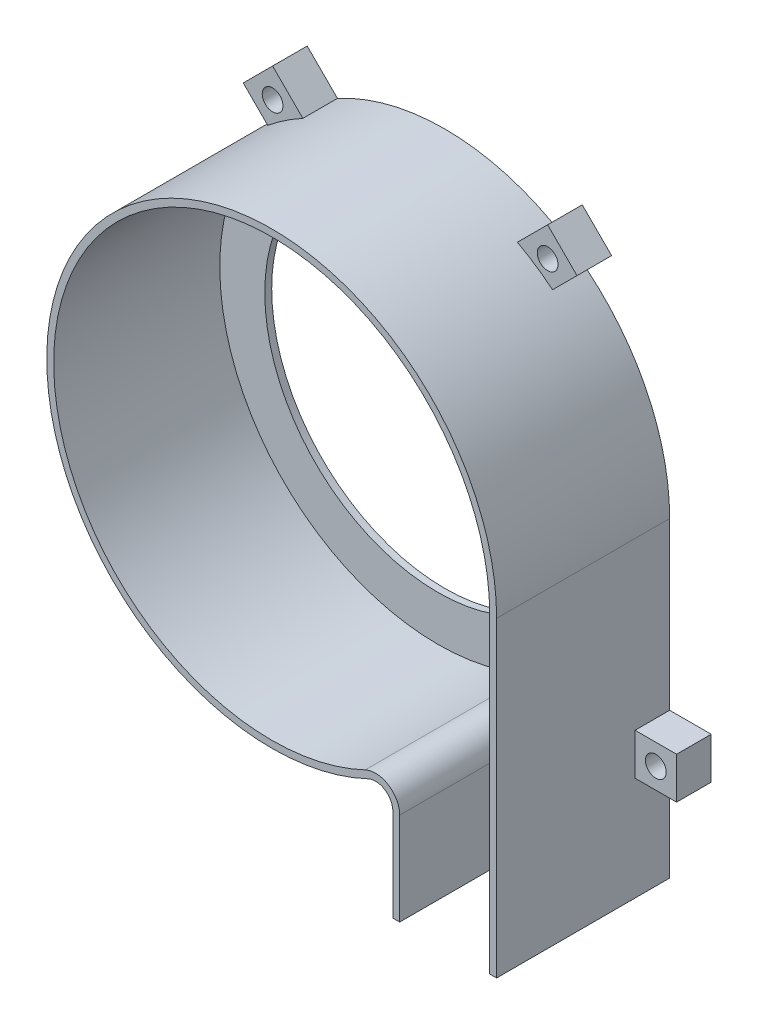
ISO-10303-21;
HEADER;
FILE_DESCRIPTION(('STEP AP214'),'2;1');
FILE_NAME('part.step','',(''),(''),'','','');
FILE_SCHEMA(('AUTOMOTIVE_DESIGN { 1 0 10303 214 1 1 1 1 }'));
ENDSEC;
DATA;
#1=APPLICATION_CONTEXT('core data for automotive mechanical design processes');
#2=APPLICATION_PROTOCOL_DEFINITION('international standard','automotive_design',2000,#1);
#3=PRODUCT_CONTEXT('',#1,'mechanical');
#4=PRODUCT('Part','Part','',(#3));
#5=PRODUCT_RELATED_PRODUCT_CATEGORY('part','',(#4));
#6=PRODUCT_DEFINITION_FORMATION('','',#4);
#7=PRODUCT_DEFINITION_CONTEXT('part definition',#1,'design');
#8=PRODUCT_DEFINITION('design','',#6,#7);
#9=PRODUCT_DEFINITION_SHAPE('','',#8);
#10=(LENGTH_UNIT() NAMED_UNIT(*) SI_UNIT(.MILLI.,.METRE.));
#11=(NAMED_UNIT(*) PLANE_ANGLE_UNIT() SI_UNIT($,.RADIAN.));
#12=(NAMED_UNIT(*) SI_UNIT($,.STERADIAN.) SOLID_ANGLE_UNIT());
#13=UNCERTAINTY_MEASURE_WITH_UNIT(LENGTH_MEASURE(1.E-05),#10,'distance_accuracy_value','');
#14=(GEOMETRIC_REPRESENTATION_CONTEXT(3) GLOBAL_UNCERTAINTY_ASSIGNED_CONTEXT((#13)) GLOBAL_UNIT_ASSIGNED_CONTEXT((#10,
#11,#12)) REPRESENTATION_CONTEXT('',''));
#15=CARTESIAN_POINT('',(0.,0.,0.));
#16=DIRECTION('',(0.,0.,1.));
#17=DIRECTION('',(1.,0.,0.));
#18=AXIS2_PLACEMENT_3D('',#15,#16,#17);
#19=CARTESIAN_POINT('',(0.,0.,30.));
#20=DIRECTION('',(0.,0.,-1.));
#21=DIRECTION('',(-1.,0.,0.));
#22=AXIS2_PLACEMENT_3D('',#19,#20,#21);
#23=CYLINDRICAL_SURFACE('',#22,32.5);
#24=CARTESIAN_POINT('',(0.,0.,0.));
#25=DIRECTION('',(0.,0.,1.));
#26=DIRECTION('',(1.,0.,0.));
#27=AXIS2_PLACEMENT_3D('',#24,#25,#26);
#28=CIRCLE('',#27,32.5);
#29=CARTESIAN_POINT('',(15.500260247219,28.5655725002753,0.));
#30=VERTEX_POINT('',#29);
#31=CARTESIAN_POINT('',(-15.500260247219,28.5655725002753,0.));
#32=VERTEX_POINT('',#31);
#33=EDGE_CURVE('E416',#30,#32,#28,.T.);
#34=ORIENTED_EDGE('',*,*,#33,.T.);
#35=DIRECTION('',(0.,0.,-1.));
#36=VECTOR('',#35,1.);
#37=CARTESIAN_POINT('',(-15.500260247219,28.5655725002753,5.));
#38=LINE('',#37,#36);
#39=CARTESIAN_POINT('',(-15.500260247219,28.5655725002753,5.));
#40=VERTEX_POINT('',#39);
#41=EDGE_CURVE('E56',#40,#32,#38,.T.);
#42=ORIENTED_EDGE('',*,*,#41,.F.);
#43=CARTESIAN_POINT('',(0.,0.,5.));
#44=DIRECTION('',(0.,0.,-1.));
#45=DIRECTION('',(-1.,0.,0.));
#46=AXIS2_PLACEMENT_3D('',#43,#44,#45);
#47=CIRCLE('',#46,32.5);
#48=CARTESIAN_POINT('',(-20.5765721784949,25.1566030573126,5.));
#49=VERTEX_POINT('',#48);
#50=EDGE_CURVE('E60',#49,#40,#47,.T.);
#51=ORIENTED_EDGE('',*,*,#50,.F.);
#52=DIRECTION('',(0.,0.,-1.));
#53=VECTOR('',#52,1.);
#54=CARTESIAN_POINT('',(-20.5765721784949,25.1566030573126,5.));
#55=LINE('',#54,#53);
#56=CARTESIAN_POINT('',(-20.5765721784949,25.1566030573126,0.));
#57=VERTEX_POINT('',#56);
#58=EDGE_CURVE('E202',#49,#57,#55,.T.);
#59=ORIENTED_EDGE('',*,*,#58,.T.);
#60=CARTESIAN_POINT('',(13.9285714285714,-29.3640068444207,0.));
#61=VERTEX_POINT('',#60);
#62=EDGE_CURVE('E411',#57,#61,#28,.T.);
#63=ORIENTED_EDGE('',*,*,#62,.T.);
#64=DIRECTION('',(0.,0.,-1.));
#65=VECTOR('',#64,1.);
#66=CARTESIAN_POINT('',(13.9285714285714,-29.3640068444207,30.));
#67=LINE('',#66,#65);
#68=CARTESIAN_POINT('',(13.9285714285714,-29.3640068444207,25.));
#69=VERTEX_POINT('',#68);
#70=EDGE_CURVE('E49',#69,#61,#67,.T.);
#71=ORIENTED_EDGE('',*,*,#70,.F.);
#72=CARTESIAN_POINT('',(0.,0.,25.));
#73=DIRECTION('',(0.,0.,1.));
#74=DIRECTION('',(1.,0.,0.));
#75=AXIS2_PLACEMENT_3D('',#72,#73,#74);
#76=CIRCLE('',#75,32.5);
#77=CARTESIAN_POINT('',(32.5,0.,25.));
#78=VERTEX_POINT('',#77);
#79=EDGE_CURVE('E329',#78,#69,#76,.T.);
#80=ORIENTED_EDGE('',*,*,#79,.F.);
#81=DIRECTION('',(0.,0.,-1.));
#82=VECTOR('',#81,1.);
#83=CARTESIAN_POINT('',(32.5,0.,30.));
#84=LINE('',#83,#82);
#85=CARTESIAN_POINT('',(32.5,0.,0.));
#86=VERTEX_POINT('',#85);
#87=EDGE_CURVE('E432',#78,#86,#84,.T.);
#88=ORIENTED_EDGE('',*,*,#87,.T.);
#89=CARTESIAN_POINT('',(20.5765721784949,25.1566030573126,0.));
#90=VERTEX_POINT('',#89);
#91=EDGE_CURVE('E412',#86,#90,#28,.T.);
#92=ORIENTED_EDGE('',*,*,#91,.T.);
#93=DIRECTION('',(0.,0.,-1.));
#94=VECTOR('',#93,1.);
#95=CARTESIAN_POINT('',(20.5765721784949,25.1566030573126,5.));
#96=LINE('',#95,#94);
#97=CARTESIAN_POINT('',(20.5765721784949,25.1566030573126,5.));
#98=VERTEX_POINT('',#97);
#99=EDGE_CURVE('E282',#98,#90,#96,.T.);
#100=ORIENTED_EDGE('',*,*,#99,.F.);
#101=CARTESIAN_POINT('',(0.,0.,5.));
#102=DIRECTION('',(0.,0.,-1.));
#103=DIRECTION('',(-1.,0.,0.));
#104=AXIS2_PLACEMENT_3D('',#101,#102,#103);
#105=CIRCLE('',#104,32.5);
#106=CARTESIAN_POINT('',(15.500260247219,28.5655725002753,5.));
#107=VERTEX_POINT('',#106);
#108=EDGE_CURVE('E260',#107,#98,#105,.T.);
#109=ORIENTED_EDGE('',*,*,#108,.F.);
#110=DIRECTION('',(0.,0.,-1.));
#111=VECTOR('',#110,1.);
#112=CARTESIAN_POINT('',(15.500260247219,28.5655725002753,5.));
#113=LINE('',#112,#111);
#114=EDGE_CURVE('E277',#107,#30,#113,.T.);
#115=ORIENTED_EDGE('',*,*,#114,.T.);
#116=EDGE_LOOP('',(#34,#42,#51,#59,#63,#71,#80,#88,#92,#100,#109,#115));
#117=FACE_BOUND('',#116,.T.);
#118=ADVANCED_FACE('F41',(#117),#23,.T.);
#119=CARTESIAN_POINT('',(32.5,0.,30.));
#120=DIRECTION('',(-1.,0.,0.));
#121=DIRECTION('',(0.,-1.,0.));
#122=AXIS2_PLACEMENT_3D('',#119,#120,#121);
#123=PLANE('',#122);
#124=DIRECTION('',(0.,0.,-1.));
#125=VECTOR('',#124,1.);
#126=CARTESIAN_POINT('',(32.5,-24.,5.));
#127=LINE('',#126,#125);
#128=CARTESIAN_POINT('',(32.5,-24.,5.));
#129=VERTEX_POINT('',#128);
#130=CARTESIAN_POINT('',(32.5,-24.,0.));
#131=VERTEX_POINT('',#130);
#132=EDGE_CURVE('E325',#129,#131,#127,.T.);
#133=ORIENTED_EDGE('',*,*,#132,.T.);
#134=DIRECTION('',(0.,1.,0.));
#135=VECTOR('',#134,1.);
#136=CARTESIAN_POINT('',(32.5,0.,0.));
#137=LINE('',#136,#135);
#138=EDGE_CURVE('E428',#131,#86,#137,.T.);
#139=ORIENTED_EDGE('',*,*,#138,.T.);
#140=ORIENTED_EDGE('',*,*,#87,.F.);
#141=DIRECTION('',(0.,1.,0.));
#142=VECTOR('',#141,1.);
#143=CARTESIAN_POINT('',(32.5,-45.,25.));
#144=LINE('',#143,#142);
#145=CARTESIAN_POINT('',(32.5,-45.,25.));
#146=VERTEX_POINT('',#145);
#147=EDGE_CURVE('E353',#146,#78,#144,.T.);
#148=ORIENTED_EDGE('',*,*,#147,.F.);
#149=DIRECTION('',(0.,0.,-1.));
#150=VECTOR('',#149,1.);
#151=CARTESIAN_POINT('',(32.5,-45.,30.));
#152=LINE('',#151,#150);
#153=CARTESIAN_POINT('',(32.5,-45.,0.));
#154=VERTEX_POINT('',#153);
#155=EDGE_CURVE('E436',#146,#154,#152,.T.);
#156=ORIENTED_EDGE('',*,*,#155,.T.);
#157=CARTESIAN_POINT('',(32.5,-30.,0.));
#158=VERTEX_POINT('',#157);
#159=EDGE_CURVE('E429',#154,#158,#137,.T.);
#160=ORIENTED_EDGE('',*,*,#159,.T.);
#161=DIRECTION('',(0.,0.,-1.));
#162=VECTOR('',#161,1.);
#163=CARTESIAN_POINT('',(32.5,-30.,5.));
#164=LINE('',#163,#162);
#165=CARTESIAN_POINT('',(32.5,-30.,5.));
#166=VERTEX_POINT('',#165);
#167=EDGE_CURVE('E330',#166,#158,#164,.T.);
#168=ORIENTED_EDGE('',*,*,#167,.F.);
#169=DIRECTION('',(0.,-1.,0.));
#170=VECTOR('',#169,1.);
#171=CARTESIAN_POINT('',(32.5,0.,5.));
#172=LINE('',#171,#170);
#173=EDGE_CURVE('E308',#129,#166,#172,.T.);
#174=ORIENTED_EDGE('',*,*,#173,.F.);
#175=EDGE_LOOP('',(#133,#139,#140,#148,#156,#160,#168,#174));
#176=FACE_BOUND('',#175,.T.);
#177=ADVANCED_FACE('F499',(#176),#123,.F.);
#178=CARTESIAN_POINT('',(17.5,-45.,30.));
#179=DIRECTION('',(0.,1.,0.));
#180=DIRECTION('',(-1.,0.,0.));
#181=AXIS2_PLACEMENT_3D('',#178,#179,#180);
#182=PLANE('',#181);
#183=DIRECTION('',(1.,0.,0.));
#184=VECTOR('',#183,1.);
#185=CARTESIAN_POINT('',(17.5,-45.,25.));
#186=LINE('',#185,#184);
#187=CARTESIAN_POINT('',(17.5,-45.,25.));
#188=VERTEX_POINT('',#187);
#189=CARTESIAN_POINT('',(18.5,-45.,25.));
#190=VERTEX_POINT('',#189);
#191=EDGE_CURVE('E350',#188,#190,#186,.T.);
#192=ORIENTED_EDGE('',*,*,#191,.F.);
#193=DIRECTION('',(0.,0.,-1.));
#194=VECTOR('',#193,1.);
#195=CARTESIAN_POINT('',(17.5,-45.,30.));
#196=LINE('',#195,#194);
#197=CARTESIAN_POINT('',(17.5,-45.,0.));
#198=VERTEX_POINT('',#197);
#199=EDGE_CURVE('E439',#188,#198,#196,.T.);
#200=ORIENTED_EDGE('',*,*,#199,.T.);
#201=DIRECTION('',(1.,0.,0.));
#202=VECTOR('',#201,1.);
#203=CARTESIAN_POINT('',(17.5,-45.,0.));
#204=LINE('',#203,#202);
#205=EDGE_CURVE('E424',#198,#154,#204,.T.);
#206=ORIENTED_EDGE('',*,*,#205,.T.);
#207=ORIENTED_EDGE('',*,*,#155,.F.);
#208=CARTESIAN_POINT('',(31.5,-45.,25.));
#209=VERTEX_POINT('',#208);
#210=EDGE_CURVE('E349',#209,#146,#186,.T.);
#211=ORIENTED_EDGE('',*,*,#210,.F.);
#212=DIRECTION('',(0.,0.,-1.));
#213=VECTOR('',#212,1.);
#214=CARTESIAN_POINT('',(31.5,-45.,30.));
#215=LINE('',#214,#213);
#216=CARTESIAN_POINT('',(31.5,-45.,1.));
#217=VERTEX_POINT('',#216);
#218=EDGE_CURVE('E382',#209,#217,#215,.T.);
#219=ORIENTED_EDGE('',*,*,#218,.T.);
#220=DIRECTION('',(1.,0.,0.));
#221=VECTOR('',#220,1.);
#222=CARTESIAN_POINT('',(17.5,-45.,1.));
#223=LINE('',#222,#221);
#224=CARTESIAN_POINT('',(18.5,-45.,1.));
#225=VERTEX_POINT('',#224);
#226=EDGE_CURVE('E387',#225,#217,#223,.T.);
#227=ORIENTED_EDGE('',*,*,#226,.F.);
#228=DIRECTION('',(0.,0.,-1.));
#229=VECTOR('',#228,1.);
#230=CARTESIAN_POINT('',(18.5,-45.,30.));
#231=LINE('',#230,#229);
#232=EDGE_CURVE('E397',#190,#225,#231,.T.);
#233=ORIENTED_EDGE('',*,*,#232,.F.);
#234=EDGE_LOOP('',(#192,#200,#206,#207,#211,#219,#227,#233));
#235=FACE_BOUND('',#234,.T.);
#236=ADVANCED_FACE('F469',(#235),#182,.F.);
#237=CARTESIAN_POINT('',(15.,-31.6227766016838,30.));
#238=DIRECTION('',(0.,0.,-1.));
#239=DIRECTION('',(-1.,0.,0.));
#240=AXIS2_PLACEMENT_3D('',#237,#238,#239);
#241=CYLINDRICAL_SURFACE('',#240,2.5);
#242=CARTESIAN_POINT('',(15.,-31.6227766016838,25.));
#243=DIRECTION('',(0.,0.,-1.));
#244=DIRECTION('',(1.,0.,0.));
#245=AXIS2_PLACEMENT_3D('',#242,#243,#244);
#246=CIRCLE('',#245,2.5);
#247=CARTESIAN_POINT('',(17.5,-31.6227766016838,25.));
#248=VERTEX_POINT('',#247);
#249=EDGE_CURVE('E343',#69,#248,#246,.T.);
#250=ORIENTED_EDGE('',*,*,#249,.F.);
#251=ORIENTED_EDGE('',*,*,#70,.T.);
#252=CARTESIAN_POINT('',(15.,-31.6227766016838,0.));
#253=DIRECTION('',(0.,0.,-1.));
#254=DIRECTION('',(1.,0.,0.));
#255=AXIS2_PLACEMENT_3D('',#252,#253,#254);
#256=CIRCLE('',#255,2.5);
#257=CARTESIAN_POINT('',(17.5,-31.6227766016838,0.));
#258=VERTEX_POINT('',#257);
#259=EDGE_CURVE('E415',#61,#258,#256,.T.);
#260=ORIENTED_EDGE('',*,*,#259,.T.);
#261=DIRECTION('',(0.,0.,-1.));
#262=VECTOR('',#261,1.);
#263=CARTESIAN_POINT('',(17.5,-31.6227766016838,30.));
#264=LINE('',#263,#262);
#265=EDGE_CURVE('E442',#248,#258,#264,.T.);
#266=ORIENTED_EDGE('',*,*,#265,.F.);
#267=EDGE_LOOP('',(#250,#251,#260,#266));
#268=FACE_BOUND('',#267,.T.);
#269=ADVANCED_FACE('F450',(#268),#241,.F.);
#270=CARTESIAN_POINT('',(17.5,-31.6227766016838,30.));
#271=DIRECTION('',(1.,0.,0.));
#272=DIRECTION('',(0.,1.,0.));
#273=AXIS2_PLACEMENT_3D('',#270,#271,#272);
#274=PLANE('',#273);
#275=DIRECTION('',(0.,-1.,0.));
#276=VECTOR('',#275,1.);
#277=CARTESIAN_POINT('',(17.5,-31.6227766016838,25.));
#278=LINE('',#277,#276);
#279=EDGE_CURVE('E346',#248,#188,#278,.T.);
#280=ORIENTED_EDGE('',*,*,#279,.F.);
#281=ORIENTED_EDGE('',*,*,#265,.T.);
#282=DIRECTION('',(0.,-1.,0.));
#283=VECTOR('',#282,1.);
#284=CARTESIAN_POINT('',(17.5,-31.6227766016838,0.));
#285=LINE('',#284,#283);
#286=EDGE_CURVE('E420',#258,#198,#285,.T.);
#287=ORIENTED_EDGE('',*,*,#286,.T.);
#288=ORIENTED_EDGE('',*,*,#199,.F.);
#289=EDGE_LOOP('',(#280,#281,#287,#288));
#290=FACE_BOUND('',#289,.T.);
#291=ADVANCED_FACE('F463',(#290),#274,.F.);
#292=CARTESIAN_POINT('',(0.,0.,30.));
#293=DIRECTION('',(0.,0.,-1.));
#294=DIRECTION('',(-1.,0.,0.));
#295=AXIS2_PLACEMENT_3D('',#292,#293,#294);
#296=CYLINDRICAL_SURFACE('',#295,31.5);
#297=DIRECTION('',(0.,0.,-1.));
#298=VECTOR('',#297,1.);
#299=CARTESIAN_POINT('',(31.5,0.,30.));
#300=LINE('',#299,#298);
#301=CARTESIAN_POINT('',(31.5,0.,25.));
#302=VERTEX_POINT('',#301);
#303=CARTESIAN_POINT('',(31.5,0.,1.));
#304=VERTEX_POINT('',#303);
#305=EDGE_CURVE('E379',#302,#304,#300,.T.);
#306=ORIENTED_EDGE('',*,*,#305,.F.);
#307=CARTESIAN_POINT('',(0.,0.,25.));
#308=DIRECTION('',(0.,0.,1.));
#309=DIRECTION('',(1.,0.,0.));
#310=AXIS2_PLACEMENT_3D('',#307,#308,#309);
#311=CIRCLE('',#310,31.5);
#312=CARTESIAN_POINT('',(13.5,-28.4604989415154,25.));
#313=VERTEX_POINT('',#312);
#314=EDGE_CURVE('E356',#302,#313,#311,.T.);
#315=ORIENTED_EDGE('',*,*,#314,.T.);
#316=DIRECTION('',(0.,0.,-1.));
#317=VECTOR('',#316,1.);
#318=CARTESIAN_POINT('',(13.5,-28.4604989415154,30.));
#319=LINE('',#318,#317);
#320=CARTESIAN_POINT('',(13.5,-28.4604989415154,1.));
#321=VERTEX_POINT('',#320);
#322=EDGE_CURVE('E374',#313,#321,#319,.T.);
#323=ORIENTED_EDGE('',*,*,#322,.T.);
#324=CARTESIAN_POINT('',(0.,0.,1.));
#325=DIRECTION('',(0.,0.,1.));
#326=DIRECTION('',(1.,0.,0.));
#327=AXIS2_PLACEMENT_3D('',#324,#325,#326);
#328=CIRCLE('',#327,31.5);
#329=EDGE_CURVE('E369',#304,#321,#328,.T.);
#330=ORIENTED_EDGE('',*,*,#329,.F.);
#331=EDGE_LOOP('',(#306,#315,#323,#330));
#332=FACE_BOUND('',#331,.T.);
#333=ADVANCED_FACE('F486',(#332),#296,.F.);
#334=CARTESIAN_POINT('',(15.,-31.6227766016838,30.));
#335=DIRECTION('',(0.,0.,-1.));
#336=DIRECTION('',(-1.,0.,0.));
#337=AXIS2_PLACEMENT_3D('',#334,#335,#336);
#338=CYLINDRICAL_SURFACE('',#337,3.5);
#339=ORIENTED_EDGE('',*,*,#322,.F.);
#340=CARTESIAN_POINT('',(15.,-31.6227766016838,25.));
#341=DIRECTION('',(0.,0.,1.));
#342=DIRECTION('',(1.,0.,0.));
#343=AXIS2_PLACEMENT_3D('',#340,#341,#342);
#344=CIRCLE('',#343,3.5);
#345=CARTESIAN_POINT('',(18.5,-31.6227766016838,25.));
#346=VERTEX_POINT('',#345);
#347=EDGE_CURVE('E360',#313,#346,#344,.F.);
#348=ORIENTED_EDGE('',*,*,#347,.T.);
#349=DIRECTION('',(0.,0.,1.));
#350=VECTOR('',#349,1.);
#351=CARTESIAN_POINT('',(18.5,-31.6227766016838,30.));
#352=LINE('',#351,#350);
#353=CARTESIAN_POINT('',(18.5,-31.6227766016838,1.));
#354=VERTEX_POINT('',#353);
#355=EDGE_CURVE('E378',#346,#354,#352,.F.);
#356=ORIENTED_EDGE('',*,*,#355,.T.);
#357=CARTESIAN_POINT('',(15.,-31.6227766016838,1.));
#358=DIRECTION('',(0.,0.,1.));
#359=DIRECTION('',(1.,0.,0.));
#360=AXIS2_PLACEMENT_3D('',#357,#358,#359);
#361=CIRCLE('',#360,3.5);
#362=EDGE_CURVE('E373',#321,#354,#361,.F.);
#363=ORIENTED_EDGE('',*,*,#362,.F.);
#364=EDGE_LOOP('',(#339,#348,#356,#363));
#365=FACE_BOUND('',#364,.T.);
#366=ADVANCED_FACE('F483',(#365),#338,.T.);
#367=CARTESIAN_POINT('',(18.5,-31.6227766016838,30.));
#368=DIRECTION('',(1.,0.,0.));
#369=DIRECTION('',(0.,1.,0.));
#370=AXIS2_PLACEMENT_3D('',#367,#368,#369);
#371=PLANE('',#370);
#372=ORIENTED_EDGE('',*,*,#355,.F.);
#373=DIRECTION('',(0.,-1.,0.));
#374=VECTOR('',#373,1.);
#375=CARTESIAN_POINT('',(18.5,-31.6227766016838,25.));
#376=LINE('',#375,#374);
#377=EDGE_CURVE('E364',#346,#190,#376,.T.);
#378=ORIENTED_EDGE('',*,*,#377,.T.);
#379=ORIENTED_EDGE('',*,*,#232,.T.);
#380=DIRECTION('',(0.,-1.,0.));
#381=VECTOR('',#380,1.);
#382=CARTESIAN_POINT('',(18.5,-31.6227766016838,1.));
#383=LINE('',#382,#381);
#384=EDGE_CURVE('E388',#354,#225,#383,.T.);
#385=ORIENTED_EDGE('',*,*,#384,.F.);
#386=EDGE_LOOP('',(#372,#378,#379,#385));
#387=FACE_BOUND('',#386,.T.);
#388=ADVANCED_FACE('F474',(#387),#371,.T.);
#389=CARTESIAN_POINT('',(31.5,0.,30.));
#390=DIRECTION('',(-1.,0.,0.));
#391=DIRECTION('',(0.,-1.,0.));
#392=AXIS2_PLACEMENT_3D('',#389,#390,#391);
#393=PLANE('',#392);
#394=ORIENTED_EDGE('',*,*,#218,.F.);
#395=DIRECTION('',(0.,1.,0.));
#396=VECTOR('',#395,1.);
#397=CARTESIAN_POINT('',(31.5,0.,25.));
#398=LINE('',#397,#396);
#399=EDGE_CURVE('E11',#209,#302,#398,.T.);
#400=ORIENTED_EDGE('',*,*,#399,.T.);
#401=ORIENTED_EDGE('',*,*,#305,.T.);
#402=DIRECTION('',(0.,1.,0.));
#403=VECTOR('',#402,1.);
#404=CARTESIAN_POINT('',(31.5,0.,1.));
#405=LINE('',#404,#403);
#406=EDGE_CURVE('E383',#217,#304,#405,.T.);
#407=ORIENTED_EDGE('',*,*,#406,.F.);
#408=EDGE_LOOP('',(#394,#400,#401,#407));
#409=FACE_BOUND('',#408,.T.);
#410=ADVANCED_FACE('F489',(#409),#393,.T.);
#411=CARTESIAN_POINT('',(0.,0.,30.));
#412=DIRECTION('',(0.,0.,-1.));
#413=DIRECTION('',(-1.,0.,0.));
#414=AXIS2_PLACEMENT_3D('',#411,#412,#413);
#415=CYLINDRICAL_SURFACE('',#414,25.);
#416=CARTESIAN_POINT('',(0.,0.,0.));
#417=DIRECTION('',(0.,0.,1.));
#418=DIRECTION('',(1.,0.,0.));
#419=AXIS2_PLACEMENT_3D('',#416,#417,#418);
#420=CIRCLE('',#419,25.);
#421=CARTESIAN_POINT('',(25.,0.,0.));
#422=VERTEX_POINT('',#421);
#423=EDGE_CURVE('E377',#422,#422,#420,.T.);
#424=ORIENTED_EDGE('',*,*,#423,.F.);
#425=EDGE_LOOP('',(#424));
#426=FACE_BOUND('',#425,.T.);
#427=CARTESIAN_POINT('',(0.,0.,1.));
#428=DIRECTION('',(0.,0.,1.));
#429=DIRECTION('',(1.,0.,0.));
#430=AXIS2_PLACEMENT_3D('',#427,#428,#429);
#431=CIRCLE('',#430,25.);
#432=CARTESIAN_POINT('',(25.,0.,1.));
#433=VERTEX_POINT('',#432);
#434=EDGE_CURVE('E368',#433,#433,#431,.T.);
#435=ORIENTED_EDGE('',*,*,#434,.T.);
#436=EDGE_LOOP('',(#435));
#437=FACE_BOUND('',#436,.T.);
#438=ADVANCED_FACE('F578',(#426,#437),#415,.F.);
#439=CARTESIAN_POINT('',(0.,0.,0.));
#440=DIRECTION('',(0.,0.,1.));
#441=DIRECTION('',(1.,0.,0.));
#442=AXIS2_PLACEMENT_3D('',#439,#440,#441);
#443=PLANE('',#442);
#444=ORIENTED_EDGE('',*,*,#91,.F.);
#445=ORIENTED_EDGE('',*,*,#138,.F.);
#446=DIRECTION('',(-1.,0.,0.));
#447=VECTOR('',#446,1.);
#448=CARTESIAN_POINT('',(0.,-24.,0.));
#449=LINE('',#448,#447);
#450=CARTESIAN_POINT('',(38.5,-24.,0.));
#451=VERTEX_POINT('',#450);
#452=EDGE_CURVE('E316',#451,#131,#449,.T.);
#453=ORIENTED_EDGE('',*,*,#452,.F.);
#454=DIRECTION('',(0.,1.,0.));
#455=VECTOR('',#454,1.);
#456=CARTESIAN_POINT('',(38.5,0.,0.));
#457=LINE('',#456,#455);
#458=CARTESIAN_POINT('',(38.5,-30.,0.));
#459=VERTEX_POINT('',#458);
#460=EDGE_CURVE('E320',#459,#451,#457,.T.);
#461=ORIENTED_EDGE('',*,*,#460,.F.);
#462=DIRECTION('',(1.,0.,0.));
#463=VECTOR('',#462,1.);
#464=CARTESIAN_POINT('',(0.,-30.,0.));
#465=LINE('',#464,#463);
#466=EDGE_CURVE('E298',#158,#459,#465,.T.);
#467=ORIENTED_EDGE('',*,*,#466,.F.);
#468=ORIENTED_EDGE('',*,*,#159,.F.);
#469=ORIENTED_EDGE('',*,*,#205,.F.);
#470=ORIENTED_EDGE('',*,*,#286,.F.);
#471=ORIENTED_EDGE('',*,*,#259,.F.);
#472=ORIENTED_EDGE('',*,*,#62,.F.);
#473=DIRECTION('',(-0.707106781186549,0.707106781186546,0.));
#474=VECTOR('',#473,1.);
#475=CARTESIAN_POINT('',(2.2900154394089,2.29001543940891,0.));
#476=LINE('',#475,#474);
#477=CARTESIAN_POINT('',(-24.1121060844276,28.6921369632453,0.));
#478=VERTEX_POINT('',#477);
#479=EDGE_CURVE('E226',#57,#478,#476,.T.);
#480=ORIENTED_EDGE('',*,*,#479,.T.);
#481=DIRECTION('',(0.707106781186546,0.707106781186549,0.));
#482=VECTOR('',#481,1.);
#483=CARTESIAN_POINT('',(-26.4021215238365,26.4021215238364,0.));
#484=LINE('',#483,#482);
#485=CARTESIAN_POINT('',(-19.8694653973084,32.9347776503646,0.));
#486=VERTEX_POINT('',#485);
#487=EDGE_CURVE('E195',#478,#486,#484,.T.);
#488=ORIENTED_EDGE('',*,*,#487,.T.);
#489=DIRECTION('',(0.707106781186549,-0.707106781186546,0.));
#490=VECTOR('',#489,1.);
#491=CARTESIAN_POINT('',(6.53265612652817,6.5326561265282,0.));
#492=LINE('',#491,#490);
#493=EDGE_CURVE('E231',#486,#32,#492,.T.);
#494=ORIENTED_EDGE('',*,*,#493,.T.);
#495=ORIENTED_EDGE('',*,*,#33,.F.);
#496=DIRECTION('',(-0.707106781186549,-0.707106781186546,0.));
#497=VECTOR('',#496,1.);
#498=CARTESIAN_POINT('',(-6.53265612652817,6.5326561265282,0.));
#499=LINE('',#498,#497);
#500=CARTESIAN_POINT('',(19.8694653973084,32.9347776503646,0.));
#501=VERTEX_POINT('',#500);
#502=EDGE_CURVE('E268',#501,#30,#499,.T.);
#503=ORIENTED_EDGE('',*,*,#502,.F.);
#504=DIRECTION('',(-0.707106781186546,0.707106781186549,0.));
#505=VECTOR('',#504,1.);
#506=CARTESIAN_POINT('',(26.4021215238365,26.4021215238364,0.));
#507=LINE('',#506,#505);
#508=CARTESIAN_POINT('',(24.1121060844276,28.6921369632453,0.));
#509=VERTEX_POINT('',#508);
#510=EDGE_CURVE('E272',#509,#501,#507,.T.);
#511=ORIENTED_EDGE('',*,*,#510,.F.);
#512=DIRECTION('',(0.707106781186549,0.707106781186546,0.));
#513=VECTOR('',#512,1.);
#514=CARTESIAN_POINT('',(-2.2900154394089,2.29001543940891,0.));
#515=LINE('',#514,#513);
#516=EDGE_CURVE('E250',#90,#509,#515,.T.);
#517=ORIENTED_EDGE('',*,*,#516,.F.);
#518=EDGE_LOOP('',(#444,#445,#453,#461,#467,#468,#469,#470,#471,#472,#480,#488,#494,#495,#503,
#511,#517));
#519=FACE_BOUND('',#518,.T.);
#520=ORIENTED_EDGE('',*,*,#423,.T.);
#521=EDGE_LOOP('',(#520));
#522=FACE_BOUND('',#521,.T.);
#523=CARTESIAN_POINT('',(35.5,-27.,0.));
#524=DIRECTION('',(0.,0.,-1.));
#525=DIRECTION('',(-1.,0.,0.));
#526=AXIS2_PLACEMENT_3D('',#523,#524,#525);
#527=CIRCLE('',#526,1.5);
#528=CARTESIAN_POINT('',(34.,-27.,0.));
#529=VERTEX_POINT('',#528);
#530=EDGE_CURVE('E281',#529,#529,#527,.T.);
#531=ORIENTED_EDGE('',*,*,#530,.F.);
#532=EDGE_LOOP('',(#531));
#533=FACE_BOUND('',#532,.T.);
#534=CARTESIAN_POINT('',(19.8694653973084,28.6921369632453,0.));
#535=DIRECTION('',(0.,0.,-1.));
#536=DIRECTION('',(-1.,0.,0.));
#537=AXIS2_PLACEMENT_3D('',#534,#535,#536);
#538=CIRCLE('',#537,1.5);
#539=CARTESIAN_POINT('',(18.3694653973084,28.6921369632453,0.));
#540=VERTEX_POINT('',#539);
#541=EDGE_CURVE('E240',#540,#540,#538,.T.);
#542=ORIENTED_EDGE('',*,*,#541,.F.);
#543=EDGE_LOOP('',(#542));
#544=FACE_BOUND('',#543,.T.);
#545=CARTESIAN_POINT('',(-19.8694653973084,28.6921369632453,0.));
#546=DIRECTION('',(0.,0.,-1.));
#547=DIRECTION('',(-1.,0.,0.));
#548=AXIS2_PLACEMENT_3D('',#545,#546,#547);
#549=CIRCLE('',#548,1.5);
#550=CARTESIAN_POINT('',(-21.3694653973084,28.6921369632453,0.));
#551=VERTEX_POINT('',#550);
#552=EDGE_CURVE('E217',#551,#551,#549,.F.);
#553=ORIENTED_EDGE('',*,*,#552,.T.);
#554=EDGE_LOOP('',(#553));
#555=FACE_BOUND('',#554,.T.);
#556=ADVANCED_FACE('F456',(#519,#522,#533,#544,#555),#443,.F.);
#557=CARTESIAN_POINT('',(0.,0.,1.));
#558=DIRECTION('',(0.,0.,1.));
#559=DIRECTION('',(1.,0.,0.));
#560=AXIS2_PLACEMENT_3D('',#557,#558,#559);
#561=PLANE('',#560);
#562=ORIENTED_EDGE('',*,*,#329,.T.);
#563=ORIENTED_EDGE('',*,*,#362,.T.);
#564=ORIENTED_EDGE('',*,*,#384,.T.);
#565=ORIENTED_EDGE('',*,*,#226,.T.);
#566=ORIENTED_EDGE('',*,*,#406,.T.);
#567=EDGE_LOOP('',(#562,#563,#564,#565,#566));
#568=FACE_BOUND('',#567,.T.);
#569=ORIENTED_EDGE('',*,*,#434,.F.);
#570=EDGE_LOOP('',(#569));
#571=FACE_BOUND('',#570,.T.);
#572=ADVANCED_FACE('F476',(#568,#571),#561,.T.);
#573=CARTESIAN_POINT('',(0.,0.,25.));
#574=DIRECTION('',(0.,0.,1.));
#575=DIRECTION('',(1.,0.,0.));
#576=AXIS2_PLACEMENT_3D('',#573,#574,#575);
#577=PLANE('',#576);
#578=ORIENTED_EDGE('',*,*,#347,.F.);
#579=ORIENTED_EDGE('',*,*,#314,.F.);
#580=ORIENTED_EDGE('',*,*,#399,.F.);
#581=ORIENTED_EDGE('',*,*,#210,.T.);
#582=ORIENTED_EDGE('',*,*,#147,.T.);
#583=ORIENTED_EDGE('',*,*,#79,.T.);
#584=ORIENTED_EDGE('',*,*,#249,.T.);
#585=ORIENTED_EDGE('',*,*,#279,.T.);
#586=ORIENTED_EDGE('',*,*,#191,.T.);
#587=ORIENTED_EDGE('',*,*,#377,.F.);
#588=EDGE_LOOP('',(#578,#579,#580,#581,#582,#583,#584,#585,#586,#587));
#589=FACE_BOUND('',#588,.T.);
#590=ADVANCED_FACE('F466',(#589),#577,.T.);
#591=CARTESIAN_POINT('',(0.,-24.,5.));
#592=DIRECTION('',(0.,-1.,0.));
#593=DIRECTION('',(0.,0.,-1.));
#594=AXIS2_PLACEMENT_3D('',#591,#592,#593);
#595=PLANE('',#594);
#596=ORIENTED_EDGE('',*,*,#452,.T.);
#597=ORIENTED_EDGE('',*,*,#132,.F.);
#598=DIRECTION('',(-1.,0.,0.));
#599=VECTOR('',#598,1.);
#600=CARTESIAN_POINT('',(0.,-24.,5.));
#601=LINE('',#600,#599);
#602=CARTESIAN_POINT('',(38.5,-24.,5.));
#603=VERTEX_POINT('',#602);
#604=EDGE_CURVE('E297',#603,#129,#601,.T.);
#605=ORIENTED_EDGE('',*,*,#604,.F.);
#606=DIRECTION('',(0.,0.,-1.));
#607=VECTOR('',#606,1.);
#608=CARTESIAN_POINT('',(38.5,-24.,5.));
#609=LINE('',#608,#607);
#610=EDGE_CURVE('E312',#603,#451,#609,.T.);
#611=ORIENTED_EDGE('',*,*,#610,.T.);
#612=EDGE_LOOP('',(#596,#597,#605,#611));
#613=FACE_BOUND('',#612,.T.);
#614=ADVANCED_FACE('F603',(#613),#595,.F.);
#615=CARTESIAN_POINT('',(0.,-30.,5.));
#616=DIRECTION('',(0.,1.,0.));
#617=DIRECTION('',(-1.,0.,0.));
#618=AXIS2_PLACEMENT_3D('',#615,#616,#617);
#619=PLANE('',#618);
#620=ORIENTED_EDGE('',*,*,#466,.T.);
#621=DIRECTION('',(0.,0.,-1.));
#622=VECTOR('',#621,1.);
#623=CARTESIAN_POINT('',(38.5,-30.,5.));
#624=LINE('',#623,#622);
#625=CARTESIAN_POINT('',(38.5,-30.,5.));
#626=VERTEX_POINT('',#625);
#627=EDGE_CURVE('E334',#626,#459,#624,.T.);
#628=ORIENTED_EDGE('',*,*,#627,.F.);
#629=DIRECTION('',(1.,0.,0.));
#630=VECTOR('',#629,1.);
#631=CARTESIAN_POINT('',(0.,-30.,5.));
#632=LINE('',#631,#630);
#633=EDGE_CURVE('E305',#166,#626,#632,.T.);
#634=ORIENTED_EDGE('',*,*,#633,.F.);
#635=ORIENTED_EDGE('',*,*,#167,.T.);
#636=EDGE_LOOP('',(#620,#628,#634,#635));
#637=FACE_BOUND('',#636,.T.);
#638=ADVANCED_FACE('F609',(#637),#619,.F.);
#639=CARTESIAN_POINT('',(35.5,-27.,5.));
#640=DIRECTION('',(0.,0.,-1.));
#641=DIRECTION('',(-1.,0.,0.));
#642=AXIS2_PLACEMENT_3D('',#639,#640,#641);
#643=CYLINDRICAL_SURFACE('',#642,1.5);
#644=CARTESIAN_POINT('',(35.5,-27.,5.));
#645=DIRECTION('',(0.,0.,-1.));
#646=DIRECTION('',(-1.,0.,0.));
#647=AXIS2_PLACEMENT_3D('',#644,#645,#646);
#648=CIRCLE('',#647,1.5);
#649=CARTESIAN_POINT('',(34.,-27.,5.));
#650=VERTEX_POINT('',#649);
#651=EDGE_CURVE('E293',#650,#650,#648,.T.);
#652=ORIENTED_EDGE('',*,*,#651,.F.);
#653=EDGE_LOOP('',(#652));
#654=FACE_BOUND('',#653,.T.);
#655=ORIENTED_EDGE('',*,*,#530,.T.);
#656=EDGE_LOOP('',(#655));
#657=FACE_BOUND('',#656,.T.);
#658=ADVANCED_FACE('F617',(#654,#657),#643,.F.);
#659=CARTESIAN_POINT('',(38.5,0.,5.));
#660=DIRECTION('',(-1.,0.,0.));
#661=DIRECTION('',(0.,0.,1.));
#662=AXIS2_PLACEMENT_3D('',#659,#660,#661);
#663=PLANE('',#662);
#664=ORIENTED_EDGE('',*,*,#460,.T.);
#665=ORIENTED_EDGE('',*,*,#610,.F.);
#666=DIRECTION('',(0.,1.,0.));
#667=VECTOR('',#666,1.);
#668=CARTESIAN_POINT('',(38.5,0.,5.));
#669=LINE('',#668,#667);
#670=EDGE_CURVE('E302',#626,#603,#669,.T.);
#671=ORIENTED_EDGE('',*,*,#670,.F.);
#672=ORIENTED_EDGE('',*,*,#627,.T.);
#673=EDGE_LOOP('',(#664,#665,#671,#672));
#674=FACE_BOUND('',#673,.T.);
#675=ADVANCED_FACE('F625',(#674),#663,.F.);
#676=CARTESIAN_POINT('',(0.,0.,5.));
#677=DIRECTION('',(0.,0.,-1.));
#678=DIRECTION('',(-1.,0.,0.));
#679=AXIS2_PLACEMENT_3D('',#676,#677,#678);
#680=PLANE('',#679);
#681=ORIENTED_EDGE('',*,*,#651,.T.);
#682=EDGE_LOOP('',(#681));
#683=FACE_BOUND('',#682,.T.);
#684=ORIENTED_EDGE('',*,*,#604,.T.);
#685=ORIENTED_EDGE('',*,*,#173,.T.);
#686=ORIENTED_EDGE('',*,*,#633,.T.);
#687=ORIENTED_EDGE('',*,*,#670,.T.);
#688=EDGE_LOOP('',(#684,#685,#686,#687));
#689=FACE_BOUND('',#688,.T.);
#690=ADVANCED_FACE('F633',(#683,#689),#680,.F.);
#691=CARTESIAN_POINT('',(-6.53265612652817,6.5326561265282,5.));
#692=DIRECTION('',(0.707106781186546,-0.707106781186549,0.));
#693=DIRECTION('',(0.707106781186549,0.707106781186546,0.));
#694=AXIS2_PLACEMENT_3D('',#691,#692,#693);
#695=PLANE('',#694);
#696=ORIENTED_EDGE('',*,*,#502,.T.);
#697=ORIENTED_EDGE('',*,*,#114,.F.);
#698=DIRECTION('',(-0.707106781186549,-0.707106781186546,0.));
#699=VECTOR('',#698,1.);
#700=CARTESIAN_POINT('',(-6.53265612652817,6.5326561265282,5.));
#701=LINE('',#700,#699);
#702=CARTESIAN_POINT('',(19.8694653973084,32.9347776503646,5.));
#703=VERTEX_POINT('',#702);
#704=EDGE_CURVE('E249',#703,#107,#701,.T.);
#705=ORIENTED_EDGE('',*,*,#704,.F.);
#706=DIRECTION('',(0.,0.,-1.));
#707=VECTOR('',#706,1.);
#708=CARTESIAN_POINT('',(19.8694653973084,32.9347776503646,5.));
#709=LINE('',#708,#707);
#710=EDGE_CURVE('E264',#703,#501,#709,.T.);
#711=ORIENTED_EDGE('',*,*,#710,.T.);
#712=EDGE_LOOP('',(#696,#697,#705,#711));
#713=FACE_BOUND('',#712,.T.);
#714=ADVANCED_FACE('F518',(#713),#695,.F.);
#715=CARTESIAN_POINT('',(-2.2900154394089,2.29001543940891,5.));
#716=DIRECTION('',(-0.707106781186546,0.707106781186549,0.));
#717=DIRECTION('',(-0.707106781186549,-0.707106781186546,0.));
#718=AXIS2_PLACEMENT_3D('',#715,#716,#717);
#719=PLANE('',#718);
#720=ORIENTED_EDGE('',*,*,#516,.T.);
#721=DIRECTION('',(0.,0.,-1.));
#722=VECTOR('',#721,1.);
#723=CARTESIAN_POINT('',(24.1121060844276,28.6921369632453,5.));
#724=LINE('',#723,#722);
#725=CARTESIAN_POINT('',(24.1121060844276,28.6921369632453,5.));
#726=VERTEX_POINT('',#725);
#727=EDGE_CURVE('E286',#726,#509,#724,.T.);
#728=ORIENTED_EDGE('',*,*,#727,.F.);
#729=DIRECTION('',(0.707106781186549,0.707106781186546,0.));
#730=VECTOR('',#729,1.);
#731=CARTESIAN_POINT('',(-2.2900154394089,2.29001543940891,5.));
#732=LINE('',#731,#730);
#733=EDGE_CURVE('E257',#98,#726,#732,.T.);
#734=ORIENTED_EDGE('',*,*,#733,.F.);
#735=ORIENTED_EDGE('',*,*,#99,.T.);
#736=EDGE_LOOP('',(#720,#728,#734,#735));
#737=FACE_BOUND('',#736,.T.);
#738=ADVANCED_FACE('F507',(#737),#719,.F.);
#739=CARTESIAN_POINT('',(19.8694653973084,28.6921369632453,5.));
#740=DIRECTION('',(0.,0.,-1.));
#741=DIRECTION('',(-1.,0.,0.));
#742=AXIS2_PLACEMENT_3D('',#739,#740,#741);
#743=CYLINDRICAL_SURFACE('',#742,1.5);
#744=CARTESIAN_POINT('',(19.8694653973084,28.6921369632453,5.));
#745=DIRECTION('',(0.,0.,-1.));
#746=DIRECTION('',(-1.,0.,0.));
#747=AXIS2_PLACEMENT_3D('',#744,#745,#746);
#748=CIRCLE('',#747,1.5);
#749=CARTESIAN_POINT('',(18.3694653973084,28.6921369632453,5.));
#750=VERTEX_POINT('',#749);
#751=EDGE_CURVE('E245',#750,#750,#748,.T.);
#752=ORIENTED_EDGE('',*,*,#751,.F.);
#753=EDGE_LOOP('',(#752));
#754=FACE_BOUND('',#753,.T.);
#755=ORIENTED_EDGE('',*,*,#541,.T.);
#756=EDGE_LOOP('',(#755));
#757=FACE_BOUND('',#756,.T.);
#758=ADVANCED_FACE('F654',(#754,#757),#743,.F.);
#759=CARTESIAN_POINT('',(26.4021215238365,26.4021215238364,5.));
#760=DIRECTION('',(-0.707106781186549,-0.707106781186546,0.));
#761=DIRECTION('',(0.707106781186546,-0.707106781186549,0.));
#762=AXIS2_PLACEMENT_3D('',#759,#760,#761);
#763=PLANE('',#762);
#764=ORIENTED_EDGE('',*,*,#510,.T.);
#765=ORIENTED_EDGE('',*,*,#710,.F.);
#766=DIRECTION('',(-0.707106781186546,0.707106781186549,0.));
#767=VECTOR('',#766,1.);
#768=CARTESIAN_POINT('',(26.4021215238365,26.4021215238364,5.));
#769=LINE('',#768,#767);
#770=EDGE_CURVE('E254',#726,#703,#769,.T.);
#771=ORIENTED_EDGE('',*,*,#770,.F.);
#772=ORIENTED_EDGE('',*,*,#727,.T.);
#773=EDGE_LOOP('',(#764,#765,#771,#772));
#774=FACE_BOUND('',#773,.T.);
#775=ADVANCED_FACE('F511',(#774),#763,.F.);
#776=CARTESIAN_POINT('',(0.,0.,5.));
#777=DIRECTION('',(0.,0.,-1.));
#778=DIRECTION('',(-1.,0.,0.));
#779=AXIS2_PLACEMENT_3D('',#776,#777,#778);
#780=PLANE('',#779);
#781=ORIENTED_EDGE('',*,*,#751,.T.);
#782=EDGE_LOOP('',(#781));
#783=FACE_BOUND('',#782,.T.);
#784=ORIENTED_EDGE('',*,*,#704,.T.);
#785=ORIENTED_EDGE('',*,*,#108,.T.);
#786=ORIENTED_EDGE('',*,*,#733,.T.);
#787=ORIENTED_EDGE('',*,*,#770,.T.);
#788=EDGE_LOOP('',(#784,#785,#786,#787));
#789=FACE_BOUND('',#788,.T.);
#790=ADVANCED_FACE('F515',(#783,#789),#780,.F.);
#791=CARTESIAN_POINT('',(6.53265612652817,6.5326561265282,5.));
#792=DIRECTION('',(0.707106781186546,0.707106781186549,0.));
#793=DIRECTION('',(-0.707106781186549,0.707106781186546,0.));
#794=AXIS2_PLACEMENT_3D('',#791,#792,#793);
#795=PLANE('',#794);
#796=ORIENTED_EDGE('',*,*,#493,.F.);
#797=DIRECTION('',(0.,0.,-1.));
#798=VECTOR('',#797,1.);
#799=CARTESIAN_POINT('',(-19.8694653973084,32.9347776503646,5.));
#800=LINE('',#799,#798);
#801=CARTESIAN_POINT('',(-19.8694653973084,32.9347776503646,5.));
#802=VERTEX_POINT('',#801);
#803=EDGE_CURVE('E201',#802,#486,#800,.T.);
#804=ORIENTED_EDGE('',*,*,#803,.F.);
#805=DIRECTION('',(0.707106781186549,-0.707106781186546,0.));
#806=VECTOR('',#805,1.);
#807=CARTESIAN_POINT('',(6.53265612652817,6.5326561265282,5.));
#808=LINE('',#807,#806);
#809=EDGE_CURVE('E210',#802,#40,#808,.T.);
#810=ORIENTED_EDGE('',*,*,#809,.T.);
#811=ORIENTED_EDGE('',*,*,#41,.T.);
#812=EDGE_LOOP('',(#796,#804,#810,#811));
#813=FACE_BOUND('',#812,.T.);
#814=ADVANCED_FACE('F521',(#813),#795,.T.);
#815=CARTESIAN_POINT('',(-26.4021215238365,26.4021215238364,5.));
#816=DIRECTION('',(-0.707106781186549,0.707106781186546,0.));
#817=DIRECTION('',(-0.707106781186546,-0.707106781186549,0.));
#818=AXIS2_PLACEMENT_3D('',#815,#816,#817);
#819=PLANE('',#818);
#820=ORIENTED_EDGE('',*,*,#487,.F.);
#821=DIRECTION('',(0.,0.,-1.));
#822=VECTOR('',#821,1.);
#823=CARTESIAN_POINT('',(-24.1121060844276,28.6921369632453,5.));
#824=LINE('',#823,#822);
#825=CARTESIAN_POINT('',(-24.1121060844276,28.6921369632453,5.));
#826=VERTEX_POINT('',#825);
#827=EDGE_CURVE('E189',#826,#478,#824,.T.);
#828=ORIENTED_EDGE('',*,*,#827,.F.);
#829=DIRECTION('',(0.707106781186546,0.707106781186549,0.));
#830=VECTOR('',#829,1.);
#831=CARTESIAN_POINT('',(-26.4021215238365,26.4021215238364,5.));
#832=LINE('',#831,#830);
#833=EDGE_CURVE('E192',#826,#802,#832,.T.);
#834=ORIENTED_EDGE('',*,*,#833,.T.);
#835=ORIENTED_EDGE('',*,*,#803,.T.);
#836=EDGE_LOOP('',(#820,#828,#834,#835));
#837=FACE_BOUND('',#836,.T.);
#838=ADVANCED_FACE('F191',(#837),#819,.T.);
#839=CARTESIAN_POINT('',(2.2900154394089,2.29001543940891,5.));
#840=DIRECTION('',(-0.707106781186546,-0.707106781186549,0.));
#841=DIRECTION('',(0.707106781186549,-0.707106781186546,0.));
#842=AXIS2_PLACEMENT_3D('',#839,#840,#841);
#843=PLANE('',#842);
#844=ORIENTED_EDGE('',*,*,#479,.F.);
#845=ORIENTED_EDGE('',*,*,#58,.F.);
#846=DIRECTION('',(-0.707106781186549,0.707106781186546,0.));
#847=VECTOR('',#846,1.);
#848=CARTESIAN_POINT('',(2.2900154394089,2.29001543940891,5.));
#849=LINE('',#848,#847);
#850=EDGE_CURVE('E208',#49,#826,#849,.T.);
#851=ORIENTED_EDGE('',*,*,#850,.T.);
#852=ORIENTED_EDGE('',*,*,#827,.T.);
#853=EDGE_LOOP('',(#844,#845,#851,#852));
#854=FACE_BOUND('',#853,.T.);
#855=ADVANCED_FACE('F213',(#854),#843,.T.);
#856=CARTESIAN_POINT('',(-19.8694653973084,28.6921369632453,5.));
#857=DIRECTION('',(0.,0.,-1.));
#858=DIRECTION('',(-1.,0.,0.));
#859=AXIS2_PLACEMENT_3D('',#856,#857,#858);
#860=CYLINDRICAL_SURFACE('',#859,1.5);
#861=CARTESIAN_POINT('',(-19.8694653973084,28.6921369632453,5.));
#862=DIRECTION('',(0.,0.,-1.));
#863=DIRECTION('',(-1.,0.,0.));
#864=AXIS2_PLACEMENT_3D('',#861,#862,#863);
#865=CIRCLE('',#864,1.5);
#866=CARTESIAN_POINT('',(-21.3694653973084,28.6921369632453,5.));
#867=VERTEX_POINT('',#866);
#868=EDGE_CURVE('E222',#867,#867,#865,.F.);
#869=ORIENTED_EDGE('',*,*,#868,.T.);
#870=EDGE_LOOP('',(#869));
#871=FACE_BOUND('',#870,.T.);
#872=ORIENTED_EDGE('',*,*,#552,.F.);
#873=EDGE_LOOP('',(#872));
#874=FACE_BOUND('',#873,.T.);
#875=ADVANCED_FACE('F691',(#871,#874),#860,.F.);
#876=CARTESIAN_POINT('',(0.,0.,5.));
#877=DIRECTION('',(0.,0.,-1.));
#878=DIRECTION('',(-1.,0.,0.));
#879=AXIS2_PLACEMENT_3D('',#876,#877,#878);
#880=PLANE('',#879);
#881=ORIENTED_EDGE('',*,*,#50,.T.);
#882=ORIENTED_EDGE('',*,*,#809,.F.);
#883=ORIENTED_EDGE('',*,*,#833,.F.);
#884=ORIENTED_EDGE('',*,*,#850,.F.);
#885=EDGE_LOOP('',(#881,#882,#883,#884));
#886=FACE_BOUND('',#885,.T.);
#887=ORIENTED_EDGE('',*,*,#868,.F.);
#888=EDGE_LOOP('',(#887));
#889=FACE_BOUND('',#888,.T.);
#890=ADVANCED_FACE('F206',(#886,#889),#880,.F.);
#891=CLOSED_SHELL('',(#118,#177,#236,#269,#291,#333,#366,#388,#410,#438,#556,#572,#590,#614,
#638,#658,#675,#690,#714,#738,#758,#775,#790,#814,#838,#855,#875,#890));
#892=MANIFOLD_SOLID_BREP('B2',#891);
#893=ADVANCED_BREP_SHAPE_REPRESENTATION('',(#18,#892),#14);
#894=SHAPE_DEFINITION_REPRESENTATION(#9,#893);
ENDSEC;
END-ISO-10303-21;
